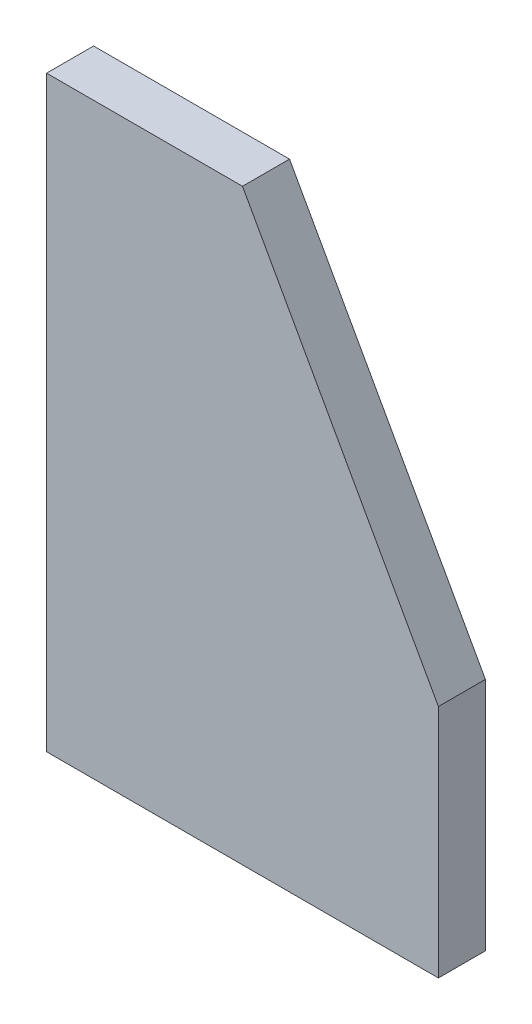
ISO-10303-21;
HEADER;
FILE_DESCRIPTION(('STEP AP214'),'2;1');
FILE_NAME('part.step','',(''),(''),'','','');
FILE_SCHEMA(('AUTOMOTIVE_DESIGN { 1 0 10303 214 1 1 1 1 }'));
ENDSEC;
DATA;
#1=APPLICATION_CONTEXT('core data for automotive mechanical design processes');
#2=APPLICATION_PROTOCOL_DEFINITION('international standard','automotive_design',2000,#1);
#3=PRODUCT_CONTEXT('',#1,'mechanical');
#4=PRODUCT('Part','Part','',(#3));
#5=PRODUCT_RELATED_PRODUCT_CATEGORY('part','',(#4));
#6=PRODUCT_DEFINITION_FORMATION('','',#4);
#7=PRODUCT_DEFINITION_CONTEXT('part definition',#1,'design');
#8=PRODUCT_DEFINITION('design','',#6,#7);
#9=PRODUCT_DEFINITION_SHAPE('','',#8);
#10=(LENGTH_UNIT() NAMED_UNIT(*) SI_UNIT(.MILLI.,.METRE.));
#11=(NAMED_UNIT(*) PLANE_ANGLE_UNIT() SI_UNIT($,.RADIAN.));
#12=(NAMED_UNIT(*) SI_UNIT($,.STERADIAN.) SOLID_ANGLE_UNIT());
#13=UNCERTAINTY_MEASURE_WITH_UNIT(LENGTH_MEASURE(1.E-05),#10,'distance_accuracy_value','');
#14=(GEOMETRIC_REPRESENTATION_CONTEXT(3) GLOBAL_UNCERTAINTY_ASSIGNED_CONTEXT((#13)) GLOBAL_UNIT_ASSIGNED_CONTEXT((#10,
#11,#12)) REPRESENTATION_CONTEXT('',''));
#15=CARTESIAN_POINT('',(0.,0.,0.));
#16=DIRECTION('',(0.,0.,1.));
#17=DIRECTION('',(1.,0.,0.));
#18=AXIS2_PLACEMENT_3D('',#15,#16,#17);
#19=CARTESIAN_POINT('',(-25.,37.5,3.));
#20=DIRECTION('',(0.,1.,0.));
#21=DIRECTION('',(0.,0.,1.));
#22=AXIS2_PLACEMENT_3D('',#19,#20,#21);
#23=PLANE('',#22);
#24=DIRECTION('',(1.,0.,0.));
#25=VECTOR('',#24,1.);
#26=CARTESIAN_POINT('',(-25.,37.5,-3.));
#27=LINE('',#26,#25);
#28=CARTESIAN_POINT('',(-25.,37.5,-3.));
#29=VERTEX_POINT('',#28);
#30=CARTESIAN_POINT('',(0.,37.5,-3.));
#31=VERTEX_POINT('',#30);
#32=EDGE_CURVE('E113',#29,#31,#27,.T.);
#33=ORIENTED_EDGE('',*,*,#32,.F.);
#34=DIRECTION('',(0.,0.,-1.));
#35=VECTOR('',#34,1.);
#36=CARTESIAN_POINT('',(-25.,37.5,3.));
#37=LINE('',#36,#35);
#38=CARTESIAN_POINT('',(-25.,37.5,3.));
#39=VERTEX_POINT('',#38);
#40=EDGE_CURVE('E11',#39,#29,#37,.T.);
#41=ORIENTED_EDGE('',*,*,#40,.F.);
#42=DIRECTION('',(1.,0.,0.));
#43=VECTOR('',#42,1.);
#44=CARTESIAN_POINT('',(-25.,37.5,3.));
#45=LINE('',#44,#43);
#46=CARTESIAN_POINT('',(0.,37.5,3.));
#47=VERTEX_POINT('',#46);
#48=EDGE_CURVE('E108',#39,#47,#45,.T.);
#49=ORIENTED_EDGE('',*,*,#48,.T.);
#50=DIRECTION('',(0.,0.,-1.));
#51=VECTOR('',#50,1.);
#52=CARTESIAN_POINT('',(0.,37.5,3.));
#53=LINE('',#52,#51);
#54=EDGE_CURVE('E39',#47,#31,#53,.T.);
#55=ORIENTED_EDGE('',*,*,#54,.T.);
#56=EDGE_LOOP('',(#33,#41,#49,#55));
#57=FACE_BOUND('',#56,.T.);
#58=ADVANCED_FACE('F36',(#57),#23,.T.);
#59=CARTESIAN_POINT('',(-25.,-37.5,3.));
#60=DIRECTION('',(-1.,0.,0.));
#61=DIRECTION('',(0.,0.,1.));
#62=AXIS2_PLACEMENT_3D('',#59,#60,#61);
#63=PLANE('',#62);
#64=DIRECTION('',(0.,1.,0.));
#65=VECTOR('',#64,1.);
#66=CARTESIAN_POINT('',(-25.,-37.5,-3.));
#67=LINE('',#66,#65);
#68=CARTESIAN_POINT('',(-25.,-37.5,-3.));
#69=VERTEX_POINT('',#68);
#70=EDGE_CURVE('E122',#69,#29,#67,.T.);
#71=ORIENTED_EDGE('',*,*,#70,.F.);
#72=DIRECTION('',(0.,0.,-1.));
#73=VECTOR('',#72,1.);
#74=CARTESIAN_POINT('',(-25.,-37.5,3.));
#75=LINE('',#74,#73);
#76=CARTESIAN_POINT('',(-25.,-37.5,3.));
#77=VERTEX_POINT('',#76);
#78=EDGE_CURVE('E45',#77,#69,#75,.T.);
#79=ORIENTED_EDGE('',*,*,#78,.F.);
#80=DIRECTION('',(0.,1.,0.));
#81=VECTOR('',#80,1.);
#82=CARTESIAN_POINT('',(-25.,-37.5,3.));
#83=LINE('',#82,#81);
#84=EDGE_CURVE('E94',#77,#39,#83,.T.);
#85=ORIENTED_EDGE('',*,*,#84,.T.);
#86=ORIENTED_EDGE('',*,*,#40,.T.);
#87=EDGE_LOOP('',(#71,#79,#85,#86));
#88=FACE_BOUND('',#87,.T.);
#89=ADVANCED_FACE('F128',(#88),#63,.T.);
#90=CARTESIAN_POINT('',(-25.,-37.5,3.));
#91=DIRECTION('',(0.,1.,0.));
#92=DIRECTION('',(0.,0.,1.));
#93=AXIS2_PLACEMENT_3D('',#90,#91,#92);
#94=PLANE('',#93);
#95=DIRECTION('',(1.,0.,0.));
#96=VECTOR('',#95,1.);
#97=CARTESIAN_POINT('',(-25.,-37.5,-3.));
#98=LINE('',#97,#96);
#99=CARTESIAN_POINT('',(25.,-37.5,-3.));
#100=VERTEX_POINT('',#99);
#101=EDGE_CURVE('E99',#69,#100,#98,.T.);
#102=ORIENTED_EDGE('',*,*,#101,.T.);
#103=DIRECTION('',(0.,0.,-1.));
#104=VECTOR('',#103,1.);
#105=CARTESIAN_POINT('',(25.,-37.5,3.));
#106=LINE('',#105,#104);
#107=CARTESIAN_POINT('',(25.,-37.5,3.));
#108=VERTEX_POINT('',#107);
#109=EDGE_CURVE('E97',#108,#100,#106,.T.);
#110=ORIENTED_EDGE('',*,*,#109,.F.);
#111=DIRECTION('',(1.,0.,0.));
#112=VECTOR('',#111,1.);
#113=CARTESIAN_POINT('',(-25.,-37.5,3.));
#114=LINE('',#113,#112);
#115=EDGE_CURVE('E88',#77,#108,#114,.T.);
#116=ORIENTED_EDGE('',*,*,#115,.F.);
#117=ORIENTED_EDGE('',*,*,#78,.T.);
#118=EDGE_LOOP('',(#102,#110,#116,#117));
#119=FACE_BOUND('',#118,.T.);
#120=ADVANCED_FACE('F98',(#119),#94,.F.);
#121=CARTESIAN_POINT('',(25.,-37.5,3.));
#122=DIRECTION('',(-1.,0.,0.));
#123=DIRECTION('',(0.,0.,1.));
#124=AXIS2_PLACEMENT_3D('',#121,#122,#123);
#125=PLANE('',#124);
#126=DIRECTION('',(0.,1.,0.));
#127=VECTOR('',#126,1.);
#128=CARTESIAN_POINT('',(25.,-37.5,-3.));
#129=LINE('',#128,#127);
#130=CARTESIAN_POINT('',(25.,-7.50000000000001,-3.));
#131=VERTEX_POINT('',#130);
#132=EDGE_CURVE('E119',#100,#131,#129,.T.);
#133=ORIENTED_EDGE('',*,*,#132,.T.);
#134=DIRECTION('',(0.,0.,-1.));
#135=VECTOR('',#134,1.);
#136=CARTESIAN_POINT('',(25.,-7.50000000000001,3.));
#137=LINE('',#136,#135);
#138=CARTESIAN_POINT('',(25.,-7.50000000000001,3.));
#139=VERTEX_POINT('',#138);
#140=EDGE_CURVE('E103',#139,#131,#137,.T.);
#141=ORIENTED_EDGE('',*,*,#140,.F.);
#142=DIRECTION('',(0.,1.,0.));
#143=VECTOR('',#142,1.);
#144=CARTESIAN_POINT('',(25.,-37.5,3.));
#145=LINE('',#144,#143);
#146=EDGE_CURVE('E92',#108,#139,#145,.T.);
#147=ORIENTED_EDGE('',*,*,#146,.F.);
#148=ORIENTED_EDGE('',*,*,#109,.T.);
#149=EDGE_LOOP('',(#133,#141,#147,#148));
#150=FACE_BOUND('',#149,.T.);
#151=ADVANCED_FACE('F105',(#150),#125,.F.);
#152=CARTESIAN_POINT('',(0.,37.5,3.));
#153=DIRECTION('',(0.874157276121538,0.485642931178632,0.));
#154=DIRECTION('',(-0.485642931178632,0.874157276121538,0.));
#155=AXIS2_PLACEMENT_3D('',#152,#153,#154);
#156=PLANE('',#155);
#157=DIRECTION('',(0.485642931178632,-0.874157276121538,0.));
#158=VECTOR('',#157,1.);
#159=CARTESIAN_POINT('',(0.,37.5,-3.));
#160=LINE('',#159,#158);
#161=EDGE_CURVE('E116',#31,#131,#160,.T.);
#162=ORIENTED_EDGE('',*,*,#161,.F.);
#163=ORIENTED_EDGE('',*,*,#54,.F.);
#164=DIRECTION('',(0.485642931178632,-0.874157276121538,0.));
#165=VECTOR('',#164,1.);
#166=CARTESIAN_POINT('',(0.,37.5,3.));
#167=LINE('',#166,#165);
#168=EDGE_CURVE('E106',#47,#139,#167,.T.);
#169=ORIENTED_EDGE('',*,*,#168,.T.);
#170=ORIENTED_EDGE('',*,*,#140,.T.);
#171=EDGE_LOOP('',(#162,#163,#169,#170));
#172=FACE_BOUND('',#171,.T.);
#173=ADVANCED_FACE('F125',(#172),#156,.T.);
#174=CARTESIAN_POINT('',(0.,0.,3.));
#175=DIRECTION('',(0.,0.,1.));
#176=DIRECTION('',(1.,0.,0.));
#177=AXIS2_PLACEMENT_3D('',#174,#175,#176);
#178=PLANE('',#177);
#179=ORIENTED_EDGE('',*,*,#48,.F.);
#180=ORIENTED_EDGE('',*,*,#84,.F.);
#181=ORIENTED_EDGE('',*,*,#115,.T.);
#182=ORIENTED_EDGE('',*,*,#146,.T.);
#183=ORIENTED_EDGE('',*,*,#168,.F.);
#184=EDGE_LOOP('',(#179,#180,#181,#182,#183));
#185=FACE_BOUND('',#184,.T.);
#186=ADVANCED_FACE('F90',(#185),#178,.T.);
#187=CARTESIAN_POINT('',(0.,0.,-3.));
#188=DIRECTION('',(0.,0.,1.));
#189=DIRECTION('',(1.,0.,0.));
#190=AXIS2_PLACEMENT_3D('',#187,#188,#189);
#191=PLANE('',#190);
#192=ORIENTED_EDGE('',*,*,#32,.T.);
#193=ORIENTED_EDGE('',*,*,#161,.T.);
#194=ORIENTED_EDGE('',*,*,#132,.F.);
#195=ORIENTED_EDGE('',*,*,#101,.F.);
#196=ORIENTED_EDGE('',*,*,#70,.T.);
#197=EDGE_LOOP('',(#192,#193,#194,#195,#196));
#198=FACE_BOUND('',#197,.T.);
#199=ADVANCED_FACE('F127',(#198),#191,.F.);
#200=CLOSED_SHELL('',(#58,#89,#120,#151,#173,#186,#199));
#201=MANIFOLD_SOLID_BREP('B2',#200);
#202=ADVANCED_BREP_SHAPE_REPRESENTATION('',(#18,#201),#14);
#203=SHAPE_DEFINITION_REPRESENTATION(#9,#202);
ENDSEC;
END-ISO-10303-21;
